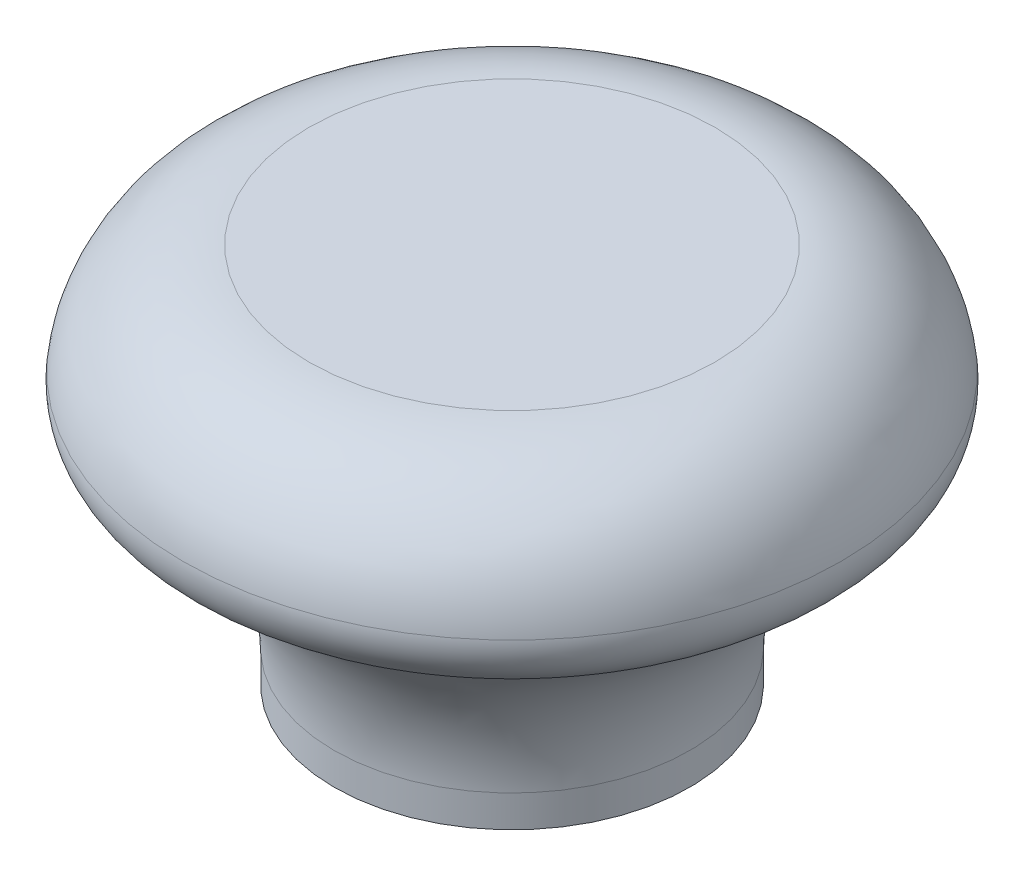
ISO-10303-21;
HEADER;
FILE_DESCRIPTION(('STEP AP214'),'2;1');
FILE_NAME('part.step','',(''),(''),'','','');
FILE_SCHEMA(('AUTOMOTIVE_DESIGN { 1 0 10303 214 1 1 1 1 }'));
ENDSEC;
DATA;
#1=APPLICATION_CONTEXT('core data for automotive mechanical design processes');
#2=APPLICATION_PROTOCOL_DEFINITION('international standard','automotive_design',2000,#1);
#3=PRODUCT_CONTEXT('',#1,'mechanical');
#4=PRODUCT('Part','Part','',(#3));
#5=PRODUCT_RELATED_PRODUCT_CATEGORY('part','',(#4));
#6=PRODUCT_DEFINITION_FORMATION('','',#4);
#7=PRODUCT_DEFINITION_CONTEXT('part definition',#1,'design');
#8=PRODUCT_DEFINITION('design','',#6,#7);
#9=PRODUCT_DEFINITION_SHAPE('','',#8);
#10=(LENGTH_UNIT() NAMED_UNIT(*) SI_UNIT(.MILLI.,.METRE.));
#11=(NAMED_UNIT(*) PLANE_ANGLE_UNIT() SI_UNIT($,.RADIAN.));
#12=(NAMED_UNIT(*) SI_UNIT($,.STERADIAN.) SOLID_ANGLE_UNIT());
#13=UNCERTAINTY_MEASURE_WITH_UNIT(LENGTH_MEASURE(1.E-05),#10,'distance_accuracy_value','');
#14=(GEOMETRIC_REPRESENTATION_CONTEXT(3) GLOBAL_UNCERTAINTY_ASSIGNED_CONTEXT((#13)) GLOBAL_UNIT_ASSIGNED_CONTEXT((#10,
#11,#12)) REPRESENTATION_CONTEXT('',''));
#15=CARTESIAN_POINT('',(0.,0.,0.));
#16=DIRECTION('',(0.,0.,1.));
#17=DIRECTION('',(1.,0.,0.));
#18=AXIS2_PLACEMENT_3D('',#15,#16,#17);
#19=CARTESIAN_POINT('',(0.,4.5,0.));
#20=DIRECTION('',(0.,-1.,0.));
#21=DIRECTION('',(0.,0.,-1.));
#22=AXIS2_PLACEMENT_3D('',#19,#20,#21);
#23=CYLINDRICAL_SURFACE('',#22,3.5);
#24=CARTESIAN_POINT('',(0.,0.627016653792583,0.));
#25=DIRECTION('',(0.,1.,0.));
#26=DIRECTION('',(0.,0.,1.));
#27=AXIS2_PLACEMENT_3D('',#24,#25,#26);
#28=CIRCLE('',#27,3.5);
#29=CARTESIAN_POINT('',(0.,0.627016653792583,3.5));
#30=VERTEX_POINT('',#29);
#31=EDGE_CURVE('E147',#30,#30,#28,.F.);
#32=ORIENTED_EDGE('',*,*,#31,.T.);
#33=EDGE_LOOP('',(#32));
#34=FACE_BOUND('',#33,.T.);
#35=CARTESIAN_POINT('',(0.,0.,0.));
#36=DIRECTION('',(0.,1.,0.));
#37=DIRECTION('',(0.,0.,1.));
#38=AXIS2_PLACEMENT_3D('',#35,#36,#37);
#39=CIRCLE('',#38,3.5);
#40=CARTESIAN_POINT('',(0.,0.,3.5));
#41=VERTEX_POINT('',#40);
#42=EDGE_CURVE('E136',#41,#41,#39,.T.);
#43=ORIENTED_EDGE('',*,*,#42,.T.);
#44=EDGE_LOOP('',(#43));
#45=FACE_BOUND('',#44,.T.);
#46=ADVANCED_FACE('F41',(#34,#45),#23,.T.);
#47=CARTESIAN_POINT('',(0.,0.,0.));
#48=DIRECTION('',(0.,1.,0.));
#49=DIRECTION('',(0.,0.,1.));
#50=AXIS2_PLACEMENT_3D('',#47,#48,#49);
#51=PLANE('',#50);
#52=DIRECTION('',(0.,0.,1.));
#53=VECTOR('',#52,1.);
#54=CARTESIAN_POINT('',(-1.625,0.,0.));
#55=LINE('',#54,#53);
#56=CARTESIAN_POINT('',(-1.625,0.,-1.40779082253011));
#57=VERTEX_POINT('',#56);
#58=CARTESIAN_POINT('',(-1.625,0.,1.40779082253011));
#59=VERTEX_POINT('',#58);
#60=EDGE_CURVE('E97',#57,#59,#55,.T.);
#61=ORIENTED_EDGE('',*,*,#60,.T.);
#62=CARTESIAN_POINT('',(0.,0.,0.));
#63=DIRECTION('',(0.,-1.,0.));
#64=DIRECTION('',(0.,0.,-1.));
#65=AXIS2_PLACEMENT_3D('',#62,#63,#64);
#66=CIRCLE('',#65,2.15);
#67=CARTESIAN_POINT('',(1.625,0.,1.40779082253011));
#68=VERTEX_POINT('',#67);
#69=EDGE_CURVE('E60',#68,#59,#66,.T.);
#70=ORIENTED_EDGE('',*,*,#69,.F.);
#71=DIRECTION('',(0.,0.,1.));
#72=VECTOR('',#71,1.);
#73=CARTESIAN_POINT('',(1.625,0.,0.));
#74=LINE('',#73,#72);
#75=CARTESIAN_POINT('',(1.625,0.,-1.40779082253011));
#76=VERTEX_POINT('',#75);
#77=EDGE_CURVE('E131',#76,#68,#74,.T.);
#78=ORIENTED_EDGE('',*,*,#77,.F.);
#79=CARTESIAN_POINT('',(0.,0.,0.));
#80=DIRECTION('',(0.,-1.,0.));
#81=DIRECTION('',(0.,0.,-1.));
#82=AXIS2_PLACEMENT_3D('',#79,#80,#81);
#83=CIRCLE('',#82,2.15);
#84=EDGE_CURVE('E128',#57,#76,#83,.T.);
#85=ORIENTED_EDGE('',*,*,#84,.F.);
#86=EDGE_LOOP('',(#61,#70,#78,#85));
#87=FACE_BOUND('',#86,.T.);
#88=ORIENTED_EDGE('',*,*,#42,.F.);
#89=EDGE_LOOP('',(#88));
#90=FACE_BOUND('',#89,.T.);
#91=ADVANCED_FACE('F166',(#87,#90),#51,.F.);
#92=CARTESIAN_POINT('',(0.,7.5,0.));
#93=DIRECTION('',(0.,1.,0.));
#94=DIRECTION('',(0.,0.,1.));
#95=AXIS2_PLACEMENT_3D('',#92,#93,#94);
#96=PLANE('',#95);
#97=CARTESIAN_POINT('',(0.,7.5,0.));
#98=DIRECTION('',(0.,1.,0.));
#99=DIRECTION('',(0.,0.,1.));
#100=AXIS2_PLACEMENT_3D('',#97,#98,#99);
#101=CIRCLE('',#100,4.);
#102=CARTESIAN_POINT('',(0.,7.5,4.));
#103=VERTEX_POINT('',#102);
#104=EDGE_CURVE('E143',#103,#103,#101,.T.);
#105=ORIENTED_EDGE('',*,*,#104,.T.);
#106=EDGE_LOOP('',(#105));
#107=FACE_BOUND('',#106,.T.);
#108=ADVANCED_FACE('F172',(#107),#96,.T.);
#109=CARTESIAN_POINT('',(0.,5.,0.));
#110=DIRECTION('',(0.,1.,0.));
#111=DIRECTION('',(0.,0.,1.));
#112=AXIS2_PLACEMENT_3D('',#109,#110,#111);
#113=TOROIDAL_SURFACE('',#112,4.,2.5);
#114=CARTESIAN_POINT('',(0.,5.33918986650897,0.));
#115=DIRECTION('',(0.,-1.,0.));
#116=DIRECTION('',(0.,0.,-1.));
#117=AXIS2_PLACEMENT_3D('',#114,#115,#116);
#118=CIRCLE('',#117,6.47688316931938);
#119=CARTESIAN_POINT('',(0.,5.33918986650897,-6.47688316931938));
#120=VERTEX_POINT('',#119);
#121=EDGE_CURVE('E50',#120,#120,#118,.F.);
#122=ORIENTED_EDGE('',*,*,#121,.T.);
#123=EDGE_LOOP('',(#122));
#124=FACE_BOUND('',#123,.T.);
#125=ORIENTED_EDGE('',*,*,#104,.F.);
#126=EDGE_LOOP('',(#125));
#127=FACE_BOUND('',#126,.T.);
#128=ADVANCED_FACE('F155',(#124,#127),#113,.T.);
#129=CARTESIAN_POINT('',(0.,0.627016653792583,0.));
#130=DIRECTION('',(0.,1.,0.));
#131=DIRECTION('',(0.,0.,1.));
#132=AXIS2_PLACEMENT_3D('',#129,#130,#131);
#133=TOROIDAL_SURFACE('',#132,7.5,4.);
#134=CARTESIAN_POINT('',(0.,4.2882144666828,0.));
#135=DIRECTION('',(0.,-1.,0.));
#136=DIRECTION('',(0.,0.,-1.));
#137=AXIS2_PLACEMENT_3D('',#134,#135,#136);
#138=CIRCLE('',#137,5.88890392127348);
#139=CARTESIAN_POINT('',(0.,4.2882144666828,-5.88890392127348));
#140=VERTEX_POINT('',#139);
#141=EDGE_CURVE('E11',#140,#140,#138,.T.);
#142=ORIENTED_EDGE('',*,*,#141,.T.);
#143=EDGE_LOOP('',(#142));
#144=FACE_BOUND('',#143,.T.);
#145=ORIENTED_EDGE('',*,*,#31,.F.);
#146=EDGE_LOOP('',(#145));
#147=FACE_BOUND('',#146,.T.);
#148=ADVANCED_FACE('F179',(#144,#147),#133,.F.);
#149=CARTESIAN_POINT('',(0.,6.5,0.));
#150=DIRECTION('',(0.,-1.,0.));
#151=DIRECTION('',(0.,0.,-1.));
#152=AXIS2_PLACEMENT_3D('',#149,#150,#151);
#153=CYLINDRICAL_SURFACE('',#152,2.15);
#154=ORIENTED_EDGE('',*,*,#69,.T.);
#155=DIRECTION('',(0.,-1.,0.));
#156=VECTOR('',#155,1.);
#157=CARTESIAN_POINT('',(-1.625,6.5,1.40779082253011));
#158=LINE('',#157,#156);
#159=CARTESIAN_POINT('',(-1.625,6.5,1.40779082253011));
#160=VERTEX_POINT('',#159);
#161=EDGE_CURVE('E104',#160,#59,#158,.T.);
#162=ORIENTED_EDGE('',*,*,#161,.F.);
#163=CARTESIAN_POINT('',(0.,6.5,0.));
#164=DIRECTION('',(0.,-1.,0.));
#165=DIRECTION('',(0.,0.,-1.));
#166=AXIS2_PLACEMENT_3D('',#163,#164,#165);
#167=CIRCLE('',#166,2.15);
#168=CARTESIAN_POINT('',(1.625,6.5,1.40779082253011));
#169=VERTEX_POINT('',#168);
#170=EDGE_CURVE('E112',#169,#160,#167,.T.);
#171=ORIENTED_EDGE('',*,*,#170,.F.);
#172=DIRECTION('',(0.,-1.,0.));
#173=VECTOR('',#172,1.);
#174=CARTESIAN_POINT('',(1.625,6.5,1.40779082253011));
#175=LINE('',#174,#173);
#176=EDGE_CURVE('E70',#169,#68,#175,.T.);
#177=ORIENTED_EDGE('',*,*,#176,.T.);
#178=EDGE_LOOP('',(#154,#162,#171,#177));
#179=FACE_BOUND('',#178,.T.);
#180=ADVANCED_FACE('F181',(#179),#153,.F.);
#181=CARTESIAN_POINT('',(1.625,6.5,0.));
#182=DIRECTION('',(1.,0.,0.));
#183=DIRECTION('',(0.,0.,-1.));
#184=AXIS2_PLACEMENT_3D('',#181,#182,#183);
#185=PLANE('',#184);
#186=ORIENTED_EDGE('',*,*,#77,.T.);
#187=ORIENTED_EDGE('',*,*,#176,.F.);
#188=DIRECTION('',(0.,0.,1.));
#189=VECTOR('',#188,1.);
#190=CARTESIAN_POINT('',(1.625,6.5,0.));
#191=LINE('',#190,#189);
#192=CARTESIAN_POINT('',(1.625,6.5,-1.40779082253011));
#193=VERTEX_POINT('',#192);
#194=EDGE_CURVE('E117',#193,#169,#191,.T.);
#195=ORIENTED_EDGE('',*,*,#194,.F.);
#196=DIRECTION('',(0.,-1.,0.));
#197=VECTOR('',#196,1.);
#198=CARTESIAN_POINT('',(1.625,6.5,-1.40779082253011));
#199=LINE('',#198,#197);
#200=EDGE_CURVE('E103',#193,#76,#199,.T.);
#201=ORIENTED_EDGE('',*,*,#200,.T.);
#202=EDGE_LOOP('',(#186,#187,#195,#201));
#203=FACE_BOUND('',#202,.T.);
#204=ADVANCED_FACE('F186',(#203),#185,.F.);
#205=CARTESIAN_POINT('',(0.,6.5,0.));
#206=DIRECTION('',(0.,-1.,0.));
#207=DIRECTION('',(0.,0.,-1.));
#208=AXIS2_PLACEMENT_3D('',#205,#206,#207);
#209=CYLINDRICAL_SURFACE('',#208,2.15);
#210=ORIENTED_EDGE('',*,*,#84,.T.);
#211=ORIENTED_EDGE('',*,*,#200,.F.);
#212=CARTESIAN_POINT('',(0.,6.5,0.));
#213=DIRECTION('',(0.,-1.,0.));
#214=DIRECTION('',(0.,0.,-1.));
#215=AXIS2_PLACEMENT_3D('',#212,#213,#214);
#216=CIRCLE('',#215,2.15);
#217=CARTESIAN_POINT('',(-1.625,6.5,-1.40779082253011));
#218=VERTEX_POINT('',#217);
#219=EDGE_CURVE('E111',#218,#193,#216,.T.);
#220=ORIENTED_EDGE('',*,*,#219,.F.);
#221=DIRECTION('',(0.,-1.,0.));
#222=VECTOR('',#221,1.);
#223=CARTESIAN_POINT('',(-1.625,6.5,-1.40779082253011));
#224=LINE('',#223,#222);
#225=EDGE_CURVE('E94',#218,#57,#224,.T.);
#226=ORIENTED_EDGE('',*,*,#225,.T.);
#227=EDGE_LOOP('',(#210,#211,#220,#226));
#228=FACE_BOUND('',#227,.T.);
#229=ADVANCED_FACE('F115',(#228),#209,.F.);
#230=CARTESIAN_POINT('',(-1.625,6.5,0.));
#231=DIRECTION('',(1.,0.,0.));
#232=DIRECTION('',(0.,0.,-1.));
#233=AXIS2_PLACEMENT_3D('',#230,#231,#232);
#234=PLANE('',#233);
#235=ORIENTED_EDGE('',*,*,#60,.F.);
#236=ORIENTED_EDGE('',*,*,#225,.F.);
#237=DIRECTION('',(0.,0.,1.));
#238=VECTOR('',#237,1.);
#239=CARTESIAN_POINT('',(-1.625,6.5,0.));
#240=LINE('',#239,#238);
#241=EDGE_CURVE('E92',#218,#160,#240,.T.);
#242=ORIENTED_EDGE('',*,*,#241,.T.);
#243=ORIENTED_EDGE('',*,*,#161,.T.);
#244=EDGE_LOOP('',(#235,#236,#242,#243));
#245=FACE_BOUND('',#244,.T.);
#246=ADVANCED_FACE('F95',(#245),#234,.T.);
#247=CARTESIAN_POINT('',(0.,6.5,0.));
#248=DIRECTION('',(0.,-1.,0.));
#249=DIRECTION('',(0.,0.,-1.));
#250=AXIS2_PLACEMENT_3D('',#247,#248,#249);
#251=PLANE('',#250);
#252=ORIENTED_EDGE('',*,*,#170,.T.);
#253=ORIENTED_EDGE('',*,*,#241,.F.);
#254=ORIENTED_EDGE('',*,*,#219,.T.);
#255=ORIENTED_EDGE('',*,*,#194,.T.);
#256=EDGE_LOOP('',(#252,#253,#254,#255));
#257=FACE_BOUND('',#256,.T.);
#258=ADVANCED_FACE('F109',(#257),#251,.T.);
#259=CARTESIAN_POINT('',(0.,5.20351391990541,0.));
#260=DIRECTION('',(0.,-1.,0.));
#261=DIRECTION('',(0.,0.,-1.));
#262=AXIS2_PLACEMENT_3D('',#259,#260,#261);
#263=TOROIDAL_SURFACE('',#262,5.48612990159183,1.);
#264=ORIENTED_EDGE('',*,*,#141,.F.);
#265=EDGE_LOOP('',(#264));
#266=FACE_BOUND('',#265,.T.);
#267=ORIENTED_EDGE('',*,*,#121,.F.);
#268=EDGE_LOOP('',(#267));
#269=FACE_BOUND('',#268,.T.);
#270=ADVANCED_FACE('F43',(#266,#269),#263,.T.);
#271=CLOSED_SHELL('',(#46,#91,#108,#128,#148,#180,#204,#229,#246,#258,#270));
#272=MANIFOLD_SOLID_BREP('B2',#271);
#273=ADVANCED_BREP_SHAPE_REPRESENTATION('',(#18,#272),#14);
#274=SHAPE_DEFINITION_REPRESENTATION(#9,#273);
ENDSEC;
END-ISO-10303-21;
